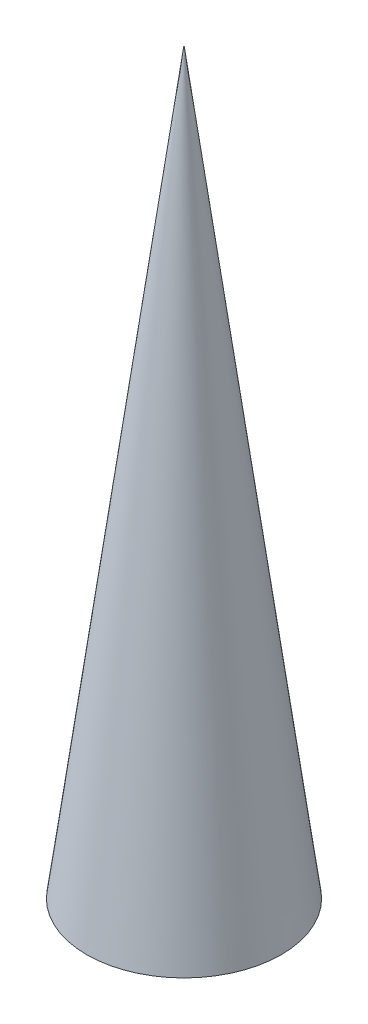
ISO-10303-21;
HEADER;
FILE_DESCRIPTION(('STEP AP214'),'2;1');
FILE_NAME('part.step','',(''),(''),'','','');
FILE_SCHEMA(('AUTOMOTIVE_DESIGN { 1 0 10303 214 1 1 1 1 }'));
ENDSEC;
DATA;
#1=APPLICATION_CONTEXT('core data for automotive mechanical design processes');
#2=APPLICATION_PROTOCOL_DEFINITION('international standard','automotive_design',2000,#1);
#3=PRODUCT_CONTEXT('',#1,'mechanical');
#4=PRODUCT('Part','Part','',(#3));
#5=PRODUCT_RELATED_PRODUCT_CATEGORY('part','',(#4));
#6=PRODUCT_DEFINITION_FORMATION('','',#4);
#7=PRODUCT_DEFINITION_CONTEXT('part definition',#1,'design');
#8=PRODUCT_DEFINITION('design','',#6,#7);
#9=PRODUCT_DEFINITION_SHAPE('','',#8);
#10=(LENGTH_UNIT() NAMED_UNIT(*) SI_UNIT(.MILLI.,.METRE.));
#11=(NAMED_UNIT(*) PLANE_ANGLE_UNIT() SI_UNIT($,.RADIAN.));
#12=(NAMED_UNIT(*) SI_UNIT($,.STERADIAN.) SOLID_ANGLE_UNIT());
#13=UNCERTAINTY_MEASURE_WITH_UNIT(LENGTH_MEASURE(1.E-05),#10,'distance_accuracy_value','');
#14=(GEOMETRIC_REPRESENTATION_CONTEXT(3) GLOBAL_UNCERTAINTY_ASSIGNED_CONTEXT((#13)) GLOBAL_UNIT_ASSIGNED_CONTEXT((#10,
#11,#12)) REPRESENTATION_CONTEXT('',''));
#15=CARTESIAN_POINT('',(0.,0.,0.));
#16=DIRECTION('',(0.,0.,1.));
#17=DIRECTION('',(1.,0.,0.));
#18=AXIS2_PLACEMENT_3D('',#15,#16,#17);
#19=CARTESIAN_POINT('',(0.,-1.58833791472468,0.));
#20=DIRECTION('',(0.,-1.,0.));
#21=DIRECTION('',(1.,0.,0.));
#22=AXIS2_PLACEMENT_3D('',#19,#20,#21);
#23=PLANE('',#22);
#24=CARTESIAN_POINT('',(0.,-1.58833791472468,0.));
#25=DIRECTION('',(0.,1.,0.));
#26=DIRECTION('',(-1.,0.,0.));
#27=AXIS2_PLACEMENT_3D('',#24,#25,#26);
#28=CIRCLE('',#27,0.209108653486262);
#29=CARTESIAN_POINT('',(0.209108653486262,-1.58833791472468,0.));
#30=VERTEX_POINT('',#29);
#31=EDGE_CURVE('E10',#30,#30,#28,.T.);
#32=ORIENTED_EDGE('',*,*,#31,.T.);
#33=EDGE_LOOP('',(#32));
#34=FACE_BOUND('',#33,.T.);
#35=ADVANCED_FACE('F38',(#34),#23,.F.);
#36=CARTESIAN_POINT('',(0.,-1.58833791472468,0.));
#37=DIRECTION('',(0.,-1.,0.));
#38=DIRECTION('',(1.,0.,0.));
#39=AXIS2_PLACEMENT_3D('',#36,#37,#38);
#40=CONICAL_SURFACE('',#39,0.209108653486262,0.130899693899576);
#41=CARTESIAN_POINT('',(0.,-1082.78057559488,0.));
#42=DIRECTION('',(0.,1.,0.));
#43=DIRECTION('',(-1.,0.,0.));
#44=AXIS2_PLACEMENT_3D('',#41,#42,#43);
#45=CIRCLE('',#44,142.550767116185);
#46=CARTESIAN_POINT('',(142.550767116185,-1082.78057559488,0.));
#47=VERTEX_POINT('',#46);
#48=EDGE_CURVE('E44',#47,#47,#45,.T.);
#49=CARTESIAN_POINT('',(142.550767116185,-1082.78057559488,0.));
#50=CARTESIAN_POINT('',(141.068041507199,-1071.51815645238,0.));
#51=CARTESIAN_POINT('',(139.585315898212,-1060.25573730988,0.));
#52=CARTESIAN_POINT('',(136.61986468024,-1037.73089902487,0.));
#53=CARTESIAN_POINT('',(135.137139071253,-1026.46847988237,0.));
#54=CARTESIAN_POINT('',(132.17168785328,-1003.94364159737,0.));
#55=CARTESIAN_POINT('',(130.688962244294,-992.681222454867,0.));
#56=CARTESIAN_POINT('',(127.723511026321,-970.156384169864,0.));
#57=CARTESIAN_POINT('',(126.240785417334,-958.893965027362,0.));
#58=CARTESIAN_POINT('',(123.275334199361,-936.369126742359,0.));
#59=CARTESIAN_POINT('',(121.792608590375,-925.106707599858,0.));
#60=CARTESIAN_POINT('',(118.827157372402,-902.581869314854,0.));
#61=CARTESIAN_POINT('',(117.344431763416,-891.319450172353,0.));
#62=CARTESIAN_POINT('',(114.378980545443,-868.79461188735,0.));
#63=CARTESIAN_POINT('',(112.896254936456,-857.532192744848,0.));
#64=CARTESIAN_POINT('',(109.930803718483,-835.007354459845,0.));
#65=CARTESIAN_POINT('',(108.448078109497,-823.744935317343,0.));
#66=CARTESIAN_POINT('',(105.482626891524,-801.22009703234,0.));
#67=CARTESIAN_POINT('',(103.999901282538,-789.957677889838,0.));
#68=CARTESIAN_POINT('',(101.034450064565,-767.432839604835,0.));
#69=CARTESIAN_POINT('',(99.5517244555783,-756.170420462333,0.));
#70=CARTESIAN_POINT('',(96.5862732376054,-733.64558217733,0.));
#71=CARTESIAN_POINT('',(95.103547628619,-722.383163034828,0.));
#72=CARTESIAN_POINT('',(92.1380964106461,-699.858324749825,0.));
#73=CARTESIAN_POINT('',(90.6553708016596,-688.595905607324,0.));
#74=CARTESIAN_POINT('',(87.6899195836867,-666.07106732232,0.));
#75=CARTESIAN_POINT('',(86.2071939747003,-654.808648179819,0.));
#76=CARTESIAN_POINT('',(83.2417427567274,-632.283809894816,0.));
#77=CARTESIAN_POINT('',(81.7590171477409,-621.021390752314,0.));
#78=CARTESIAN_POINT('',(78.793565929768,-598.496552467311,0.));
#79=CARTESIAN_POINT('',(77.3108403207816,-587.234133324809,0.));
#80=CARTESIAN_POINT('',(74.3453891028087,-564.709295039806,0.));
#81=CARTESIAN_POINT('',(72.8626634938222,-553.446875897304,0.));
#82=CARTESIAN_POINT('',(69.8972122758493,-530.922037612301,0.));
#83=CARTESIAN_POINT('',(68.4144866668629,-519.659618469799,0.));
#84=CARTESIAN_POINT('',(65.44903544889,-497.134780184796,0.));
#85=CARTESIAN_POINT('',(63.9663098399036,-485.872361042294,0.));
#86=CARTESIAN_POINT('',(61.0008586219307,-463.347522757291,0.));
#87=CARTESIAN_POINT('',(59.5181330129442,-452.08510361479,0.));
#88=CARTESIAN_POINT('',(56.5526817949713,-429.560265329786,0.));
#89=CARTESIAN_POINT('',(55.0699561859849,-418.297846187285,0.));
#90=CARTESIAN_POINT('',(52.104504968012,-395.773007902281,0.));
#91=CARTESIAN_POINT('',(50.6217793590255,-384.51058875978,0.));
#92=CARTESIAN_POINT('',(47.6563281410526,-361.985750474777,0.));
#93=CARTESIAN_POINT('',(46.1736025320662,-350.723331332275,0.));
#94=CARTESIAN_POINT('',(43.2081513140933,-328.198493047272,0.));
#95=CARTESIAN_POINT('',(41.7254257051068,-316.93607390477,0.));
#96=CARTESIAN_POINT('',(38.7599744871339,-294.411235619767,0.));
#97=CARTESIAN_POINT('',(37.2772488781475,-283.148816477265,0.));
#98=CARTESIAN_POINT('',(34.3117976601746,-260.623978192262,0.));
#99=CARTESIAN_POINT('',(32.8290720511881,-249.36155904976,0.));
#100=CARTESIAN_POINT('',(29.8636208332152,-226.836720764757,0.));
#101=CARTESIAN_POINT('',(28.3808952242288,-215.574301622255,0.));
#102=CARTESIAN_POINT('',(25.4154440062559,-193.049463337252,0.));
#103=CARTESIAN_POINT('',(23.9327183972694,-181.787044194751,0.));
#104=CARTESIAN_POINT('',(20.9672671792965,-159.262205909747,0.));
#105=CARTESIAN_POINT('',(19.4845415703101,-147.999786767246,0.));
#106=CARTESIAN_POINT('',(16.5190903523372,-125.474948482243,0.));
#107=CARTESIAN_POINT('',(15.0363647433508,-114.212529339741,0.));
#108=CARTESIAN_POINT('',(12.0709135253779,-91.6876910547377,0.));
#109=CARTESIAN_POINT('',(10.5881879163914,-80.4252719122361,0.));
#110=CARTESIAN_POINT('',(7.62273669841851,-57.9004336272328,0.));
#111=CARTESIAN_POINT('',(6.14001108943206,-46.6380144847312,0.));
#112=CARTESIAN_POINT('',(3.17455987145916,-24.1131761997279,0.));
#113=CARTESIAN_POINT('',(1.69183426247271,-12.8507570572263,0.));
#114=CARTESIAN_POINT('',(0.209108653486262,-1.58833791472468,0.));
#115=B_SPLINE_CURVE_WITH_KNOTS('',3,(#49,#50,#51,#52,#53,#54,#55,#56,#57,#58,#59,#60,#61,#62,
#63,#64,#65,#66,#67,#68,#69,#70,#71,#72,#73,#74,#75,#76,#77,#78,#79,#80,#81,#82,#83,#84,#85,#86,
#87,#88,#89,#90,#91,#92,#93,#94,#95,#96,#97,#98,#99,#100,#101,#102,#103,#104,#105,#106,#107,
#108,#109,#110,#111,#112,#113,#114),.UNSPECIFIED.,.F.,.F.,(4,2,2,2,2,2,2,2,2,2,2,2,2,2,2,2,2,2,
2,2,2,2,2,2,2,2,2,2,2,2,2,2,4),(0.,34.0788063399583,68.1576126799166,102.236419019875,
136.315225359833,170.394031699791,204.47283803975,238.551644379708,272.630450719666,
306.709257059624,340.788063399583,374.866869739541,408.945676079499,443.024482419458,
477.103288759416,511.182095099374,545.260901439332,579.339707779291,613.418514119249,
647.497320459207,681.576126799166,715.654933139124,749.733739479082,783.81254581904,
817.891352158999,851.970158498957,886.048964838915,920.127771178874,954.206577518832,
988.28538385879,1022.36419019875,1056.44299653871,1090.52180287866),.UNSPECIFIED.);
#116=EDGE_CURVE('BSEAM50',#47,#30,#115,.T.);
#117=ORIENTED_EDGE('',*,*,#48,.T.);
#118=ORIENTED_EDGE('',*,*,#31,.F.);
#119=ORIENTED_EDGE('',*,*,#116,.T.);
#120=ORIENTED_EDGE('',*,*,#116,.F.);
#121=EDGE_LOOP('',(#117,#119,#118,#120));
#122=FACE_BOUND('',#121,.T.);
#123=ADVANCED_FACE('F50',(#122),#40,.T.);
#124=CARTESIAN_POINT('',(0.,-1082.78057559488,0.));
#125=DIRECTION('',(0.,-1.,0.));
#126=DIRECTION('',(1.,0.,0.));
#127=AXIS2_PLACEMENT_3D('',#124,#125,#126);
#128=PLANE('',#127);
#129=ORIENTED_EDGE('',*,*,#48,.F.);
#130=EDGE_LOOP('',(#129));
#131=FACE_BOUND('',#130,.T.);
#132=ADVANCED_FACE('F53',(#131),#128,.T.);
#133=CLOSED_SHELL('',(#35,#123,#132));
#134=MANIFOLD_SOLID_BREP('B2',#133);
#135=ADVANCED_BREP_SHAPE_REPRESENTATION('',(#18,#134),#14);
#136=SHAPE_DEFINITION_REPRESENTATION(#9,#135);
ENDSEC;
END-ISO-10303-21;
